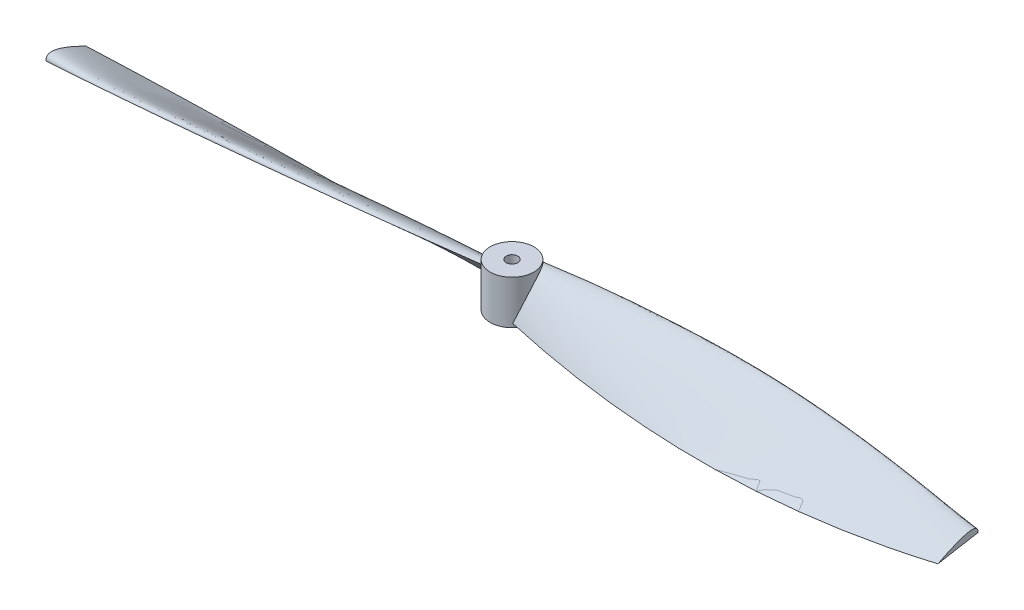
ISO-10303-21;
HEADER;
FILE_DESCRIPTION(('STEP AP214'),'2;1');
FILE_NAME('part.step','',(''),(''),'','','');
FILE_SCHEMA(('AUTOMOTIVE_DESIGN { 1 0 10303 214 1 1 1 1 }'));
ENDSEC;
DATA;
#1=APPLICATION_CONTEXT('core data for automotive mechanical design processes');
#2=APPLICATION_PROTOCOL_DEFINITION('international standard','automotive_design',2000,#1);
#3=PRODUCT_CONTEXT('',#1,'mechanical');
#4=PRODUCT('Part','Part','',(#3));
#5=PRODUCT_RELATED_PRODUCT_CATEGORY('part','',(#4));
#6=PRODUCT_DEFINITION_FORMATION('','',#4);
#7=PRODUCT_DEFINITION_CONTEXT('part definition',#1,'design');
#8=PRODUCT_DEFINITION('design','',#6,#7);
#9=PRODUCT_DEFINITION_SHAPE('','',#8);
#10=(LENGTH_UNIT() NAMED_UNIT(*) SI_UNIT(.MILLI.,.METRE.));
#11=(NAMED_UNIT(*) PLANE_ANGLE_UNIT() SI_UNIT($,.RADIAN.));
#12=(NAMED_UNIT(*) SI_UNIT($,.STERADIAN.) SOLID_ANGLE_UNIT());
#13=UNCERTAINTY_MEASURE_WITH_UNIT(LENGTH_MEASURE(1.E-05),#10,'distance_accuracy_value','');
#14=(GEOMETRIC_REPRESENTATION_CONTEXT(3) GLOBAL_UNCERTAINTY_ASSIGNED_CONTEXT((#13)) GLOBAL_UNIT_ASSIGNED_CONTEXT((#10,
#11,#12)) REPRESENTATION_CONTEXT('',''));
#15=CARTESIAN_POINT('',(0.,0.,0.));
#16=DIRECTION('',(0.,0.,1.));
#17=DIRECTION('',(1.,0.,0.));
#18=AXIS2_PLACEMENT_3D('',#15,#16,#17);
#19=CARTESIAN_POINT('',(0.,15.,0.));
#20=DIRECTION('',(0.,-1.,0.));
#21=DIRECTION('',(0.,0.,-1.));
#22=AXIS2_PLACEMENT_3D('',#19,#20,#21);
#23=CYLINDRICAL_SURFACE('',#22,6.);
#24=CARTESIAN_POINT('',(0.,15.,0.));
#25=DIRECTION('',(0.,1.,0.));
#26=DIRECTION('',(0.,0.,1.));
#27=AXIS2_PLACEMENT_3D('',#24,#25,#26);
#28=CIRCLE('',#27,6.);
#29=CARTESIAN_POINT('',(0.,15.,6.));
#30=VERTEX_POINT('',#29);
#31=EDGE_CURVE('E229',#30,#30,#28,.T.);
#32=ORIENTED_EDGE('',*,*,#31,.F.);
#33=EDGE_LOOP('',(#32));
#34=FACE_BOUND('',#33,.T.);
#35=CARTESIAN_POINT('',(3.95496399735066,14.1319443424082,-4.51201283017459));
#36=CARTESIAN_POINT('',(4.00119866207085,14.1418761661484,-4.47148350148986));
#37=CARTESIAN_POINT('',(4.04676949293845,14.1521523074791,-4.43028466918364));
#38=CARTESIAN_POINT('',(4.13661155901059,14.1727714372621,-4.34651853911986));
#39=CARTESIAN_POINT('',(4.18088292137542,14.1831144190519,-4.30395137612096));
#40=CARTESIAN_POINT('',(4.26860420712328,14.2033493668861,-4.2169739020823));
#41=CARTESIAN_POINT('',(4.31204130790099,14.2132357187568,-4.17254931182353));
#42=CARTESIAN_POINT('',(4.39763247550506,14.2319387936106,-4.08224218085359));
#43=CARTESIAN_POINT('',(4.4397862119144,14.2407552428506,-4.03635927079315));
#44=CARTESIAN_POINT('',(4.55560015297822,14.2632268135488,-3.9062759979549));
#45=CARTESIAN_POINT('',(4.62781459404936,14.275194959149,-3.82046737537932));
#46=CARTESIAN_POINT('',(4.76764641519559,14.2920571136843,-3.64447150067945));
#47=CARTESIAN_POINT('',(4.83526364729404,14.2969508950097,-3.55428410776972));
#48=CARTESIAN_POINT('',(4.96497447416731,14.2980190313878,-3.37069482613974));
#49=CARTESIAN_POINT('',(5.02709720890441,14.2942426587109,-3.27731405836729));
#50=CARTESIAN_POINT('',(5.14564130596027,14.2770098538055,-3.08785609725892));
#51=CARTESIAN_POINT('',(5.2020635542291,14.2635549284321,-2.99177932590147));
#52=CARTESIAN_POINT('',(5.30445865853128,14.2280256137596,-2.80589847440146));
#53=CARTESIAN_POINT('',(5.35090628198875,14.2067262765733,-2.71620694978279));
#54=CARTESIAN_POINT('',(5.43836092026612,14.1557083341582,-2.53657452656943));
#55=CARTESIAN_POINT('',(5.4793680503625,14.1259899073601,-2.44663363329976));
#56=CARTESIAN_POINT('',(5.55604445243874,14.0585084183418,-2.26714097011901));
#57=CARTESIAN_POINT('',(5.59169658182939,14.0207204207173,-2.17759130498496));
#58=CARTESIAN_POINT('',(5.6576784178956,13.9378735253437,-1.99991538168775));
#59=CARTESIAN_POINT('',(5.68800731050094,13.8928135175219,-1.91178934310424));
#60=CARTESIAN_POINT('',(5.75004997618697,13.7851159174677,-1.7174378661822));
#61=CARTESIAN_POINT('',(5.78047301680915,13.720820378209,-1.61172011025793));
#62=CARTESIAN_POINT('',(5.83443943174986,13.5839701398727,-1.40387416542246));
#63=CARTESIAN_POINT('',(5.85797720082957,13.511408778056,-1.3017489603418));
#64=CARTESIAN_POINT('',(5.89892795100441,13.3594296656734,-1.10141171965112));
#65=CARTESIAN_POINT('',(5.91633809830622,13.2800087639187,-1.00320151314785));
#66=CARTESIAN_POINT('',(5.94575519380071,13.1155595795372,-0.810838930639299));
#67=CARTESIAN_POINT('',(5.95776379699141,13.0305330236137,-0.716685319725059));
#68=CARTESIAN_POINT('',(5.97874259666434,12.8405842957939,-0.516229135785683));
#69=CARTESIAN_POINT('',(5.9868172364012,12.7347789993457,-0.410672681334593));
#70=CARTESIAN_POINT('',(5.99739566852743,12.5179543435598,-0.204665478838717));
#71=CARTESIAN_POINT('',(5.99989577625281,12.4069315850406,-0.104218150663553));
#72=CARTESIAN_POINT('',(6.00009786317036,12.1806777826948,0.091862839330213));
#73=CARTESIAN_POINT('',(5.99779849228568,12.0654455637199,0.1874951389482));
#74=CARTESIAN_POINT('',(5.98901074604875,11.8306365522089,0.375003581181962));
#75=CARTESIAN_POINT('',(5.98248929297612,11.7110325514432,0.466843919187223));
#76=CARTESIAN_POINT('',(5.9657736296792,11.469011736749,0.646265748632677));
#77=CARTESIAN_POINT('',(5.95558095748211,11.3465961208008,0.733849006128762));
#78=CARTESIAN_POINT('',(5.93196894501283,11.0994081860308,0.905101059696859));
#79=CARTESIAN_POINT('',(5.91855019734181,10.9746363039084,0.988770571320956));
#80=CARTESIAN_POINT('',(5.87784826378373,10.6298255472942,1.2132331983065));
#81=CARTESIAN_POINT('',(5.84766254920247,10.4077489447029,1.35037981597137));
#82=CARTESIAN_POINT('',(5.78011913115594,9.95895856317901,1.61520497883173));
#83=CARTESIAN_POINT('',(5.74275698831872,9.7322419919087,1.74287759523708));
#84=CARTESIAN_POINT('',(5.66188080256109,9.2750289323539,1.98998148085972));
#85=CARTESIAN_POINT('',(5.61835801850042,9.04452749187421,2.1094006749335));
#86=CARTESIAN_POINT('',(5.52591312283548,8.58052948491552,2.34090501628557));
#87=CARTESIAN_POINT('',(5.47698332656377,8.34702908347388,2.4529793550768));
#88=CARTESIAN_POINT('',(5.37428337141775,7.87774272146882,2.67049710701097));
#89=CARTESIAN_POINT('',(5.3205086468732,7.64195479590365,2.77593410306971));
#90=CARTESIAN_POINT('',(5.21147228839771,7.18116172874861,2.97536273217888));
#91=CARTESIAN_POINT('',(5.1564352967502,6.95623718118787,3.06966454440444));
#92=CARTESIAN_POINT('',(5.04266161293469,6.50548753510666,3.25318467365871));
#93=CARTESIAN_POINT('',(4.98392804636962,6.27966334468936,3.3424071670317));
#94=CARTESIAN_POINT('',(4.86297497713012,5.82769927044378,3.51605482653032));
#95=CARTESIAN_POINT('',(4.80076321762416,5.6015611012892,3.6004898672123));
#96=CARTESIAN_POINT('',(4.67301842303342,5.14954876154523,3.76479773551994));
#97=CARTESIAN_POINT('',(4.60749806024655,4.92367653865321,3.84468579774269));
#98=CARTESIAN_POINT('',(4.4732353970314,4.47277052232558,4.00007555395276));
#99=CARTESIAN_POINT('',(4.404511224597,4.24773832479611,4.07559753311766));
#100=CARTESIAN_POINT('',(4.33400281681537,4.0226630110739,4.14926735506842));
#101=B_SPLINE_CURVE_WITH_KNOTS('',3,(#35,#36,#37,#38,#39,#40,#41,#42,#43,#44,#45,#46,#47,#48,
#49,#50,#51,#52,#53,#54,#55,#56,#57,#58,#59,#60,#61,#62,#63,#64,#65,#66,#67,#68,#69,#70,#71,#72,
#73,#74,#75,#76,#77,#78,#79,#80,#81,#82,#83,#84,#85,#86,#87,#88,#89,#90,#91,#92,#93,#94,#95,#96,
#97,#98,#99,#100),.UNSPECIFIED.,.F.,.F.,(4,2,2,2,2,2,2,2,2,2,2,2,2,2,2,2,2,2,2,2,2,2,2,2,2,2,2,
2,2,2,2,2,4),(0.,0.186832386850806,0.373646429738278,0.562348377681432,0.751098505178312,
1.08911020703464,1.42713278378886,1.76323914500326,2.09929318910327,2.40848214428971,
2.71766454714664,3.02781653395617,3.33801591033931,3.71968091464173,4.10165576981661,
4.48380704251724,4.86584114666002,5.31452380874846,5.76350295408722,6.21260841273852,
6.66527565736122,7.11775348090461,7.57014825174456,8.35799570943213,9.14633211204672,
9.93579848636275,10.7264016749857,11.5177578493112,12.267749751776,13.0171158106024,
13.7648753611704,14.5099609501117,15.2512481487481),.UNSPECIFIED.);
#102=CARTESIAN_POINT('',(3.95496399735066,14.1319443424082,-4.51201283017459));
#103=VERTEX_POINT('',#102);
#104=CARTESIAN_POINT('',(4.33400281681538,4.02266301107394,4.14926735506841));
#105=VERTEX_POINT('',#104);
#106=EDGE_CURVE('E87',#103,#105,#101,.T.);
#107=ORIENTED_EDGE('',*,*,#106,.F.);
#108=CARTESIAN_POINT('',(4.33400281681538,4.02266301107394,4.14926735506841));
#109=CARTESIAN_POINT('',(4.46618815203607,4.19002698614196,4.01114825737754));
#110=CARTESIAN_POINT('',(4.58992268478001,4.36036705230832,3.8687428713589));
#111=CARTESIAN_POINT('',(4.8208662031274,4.70583878910611,3.57686337538926));
#112=CARTESIAN_POINT('',(4.92808861104108,4.88096643020026,3.42739513721856));
#113=CARTESIAN_POINT('',(5.12622300254722,5.23445980047151,3.12323984429937));
#114=CARTESIAN_POINT('',(5.21719514678378,5.41281077582022,2.96857466842872));
#115=CARTESIAN_POINT('',(5.38373201485981,5.77264291612813,2.65462222658457));
#116=CARTESIAN_POINT('',(5.45929204204786,5.95412501704007,2.49533356850415));
#117=CARTESIAN_POINT('',(5.69228807666882,6.57994067997149,1.94362942629013));
#118=CARTESIAN_POINT('',(5.81307014022031,7.0305191253567,1.54228694537885));
#119=CARTESIAN_POINT('',(5.96977051002967,7.93994168750207,0.730303620174496));
#120=CARTESIAN_POINT('',(6.00543754535854,8.39880625842876,0.319638848780571));
#121=CARTESIAN_POINT('',(5.99569014627772,9.13227165536893,-0.333591584484566));
#122=CARTESIAN_POINT('',(5.97716736483079,9.40657699006194,-0.577179160471801));
#123=CARTESIAN_POINT('',(5.91046712990247,9.95458499931698,-1.0611572273053));
#124=CARTESIAN_POINT('',(5.86228394943976,10.2282875472448,-1.30154709156122));
#125=CARTESIAN_POINT('',(5.73633638917936,10.7730893233621,-1.77611541607573));
#126=CARTESIAN_POINT('',(5.65864202210914,11.0441931680119,-2.01030718491523));
#127=CARTESIAN_POINT('',(5.47337671734091,11.5830370624301,-2.47055866829869));
#128=CARTESIAN_POINT('',(5.36581466201944,11.8507780875653,-2.69662077798773));
#129=CARTESIAN_POINT('',(5.16259271429027,12.2898720080848,-3.06186803979435));
#130=CARTESIAN_POINT('',(5.07558278494719,12.462676605676,-3.20417005687663));
#131=CARTESIAN_POINT('',(4.8883149647486,12.8055081289077,-3.48318679339398));
#132=CARTESIAN_POINT('',(4.78806198124846,12.9755360573754,-3.61990355805283));
#133=CARTESIAN_POINT('',(4.57385762426114,13.3124812731428,-3.88705730959354));
#134=CARTESIAN_POINT('',(4.45988318649478,13.4793927625343,-4.01748319203434));
#135=CARTESIAN_POINT('',(4.21796805153895,13.8090515115888,-4.27075532933734));
#136=CARTESIAN_POINT('',(4.09001633973535,13.9717953605076,-4.39359548529906));
#137=CARTESIAN_POINT('',(3.95496399735066,14.1319443424082,-4.51201283017459));
#138=B_SPLINE_CURVE_WITH_KNOTS('',3,(#108,#109,#110,#111,#112,#113,#114,#115,#116,#117,#118,
#119,#120,#121,#122,#123,#124,#125,#126,#127,#128,#129,#130,#131,#132,#133,#134,#135,#136,#137),
.UNSPECIFIED.,.F.,.F.,(4,2,2,2,2,2,2,2,2,2,2,2,2,2,4),(0.,0.761912345224491,1.52320204331146,
2.28161213718473,3.04025300296389,4.87934941174568,6.72386839850998,7.82474773694386,
8.92583970548571,10.0243355816356,11.1225051244168,11.8426242918347,12.5624773560645,
13.2835577677298,14.0052105737999),.UNSPECIFIED.);
#139=EDGE_CURVE('E217',#105,#103,#138,.T.);
#140=ORIENTED_EDGE('',*,*,#139,.F.);
#141=EDGE_LOOP('',(#107,#140));
#142=FACE_BOUND('',#141,.T.);
#143=CARTESIAN_POINT('',(-3.95496399735066,14.1319443424082,4.51201283017459));
#144=CARTESIAN_POINT('',(-4.07301258590449,13.9919720922848,4.40851566135976));
#145=CARTESIAN_POINT('',(-4.18563428903774,13.8500035140051,4.3016278281284));
#146=CARTESIAN_POINT('',(-4.40009913790186,13.5628696315802,4.08199796443968));
#147=CARTESIAN_POINT('',(-4.50195563609008,13.417708563861,3.96926345095488));
#148=CARTESIAN_POINT('',(-4.69523078552242,13.124676312486,3.73863911310308));
#149=CARTESIAN_POINT('',(-4.78665264497937,12.9768059781311,3.62075088878637));
#150=CARTESIAN_POINT('',(-4.95881266970242,12.6795854354442,3.38109932242871));
#151=CARTESIAN_POINT('',(-5.03960495200348,12.5302472434192,3.25935986243932));
#152=CARTESIAN_POINT('',(-5.19124775832872,12.2296795403326,3.01197594581293));
#153=CARTESIAN_POINT('',(-5.26209527722762,12.0784494725521,2.88633032275507));
#154=CARTESIAN_POINT('',(-5.39393602853731,11.7745051656814,2.63173064198554));
#155=CARTESIAN_POINT('',(-5.45492816218919,11.6217907631148,2.50277621723621));
#156=CARTESIAN_POINT('',(-5.6823064639648,11.0006231380654,1.97459479571869));
#157=CARTESIAN_POINT('',(-5.80832968687274,10.5269049010096,1.56342091917948));
#158=CARTESIAN_POINT('',(-5.97108525735197,9.57442063696116,0.726859754562274));
#159=CARTESIAN_POINT('',(-6.00753848388859,9.09564348835387,0.301432212840051));
#160=CARTESIAN_POINT('',(-5.99351259472467,8.3371211120348,-0.37511009284523));
#161=CARTESIAN_POINT('',(-5.9725920477003,8.05640523298941,-0.626043476940594));
#162=CARTESIAN_POINT('',(-5.89884471414157,7.49704958452404,-1.12580960279973));
#163=CARTESIAN_POINT('',(-5.84600900913781,7.21841041746801,-1.37464173766871));
#164=CARTESIAN_POINT('',(-5.70797979713915,6.66573609371351,-1.86655299579988));
#165=CARTESIAN_POINT('',(-5.62289222708136,6.39168889867209,-2.10964821536638));
#166=CARTESIAN_POINT('',(-5.4194903260282,5.84919257114887,-2.58777528815577));
#167=CARTESIAN_POINT('',(-5.30119858375689,5.58073976572822,-2.82281250166595));
#168=CARTESIAN_POINT('',(-5.05194321798434,5.09399236770938,-3.2446655765344));
#169=CARTESIAN_POINT('',(-4.92606393610409,4.87456512655725,-3.43316458360225));
#170=CARTESIAN_POINT('',(-4.71842967964133,4.5507839047498,-3.70804752102877));
#171=CARTESIAN_POINT('',(-4.64605764554573,4.44371854823619,-3.79839035923032));
#172=CARTESIAN_POINT('',(-4.49488236250091,4.2316028575674,-3.97613314758453));
#173=CARTESIAN_POINT('',(-4.41607621271332,4.12655345896766,-4.06353174495334));
#174=CARTESIAN_POINT('',(-4.33400281681538,4.02266301107394,-4.14926735506841));
#175=B_SPLINE_CURVE_WITH_KNOTS('',3,(#143,#144,#145,#146,#147,#148,#149,#150,#151,#152,#153,
#154,#155,#156,#157,#158,#159,#160,#161,#162,#163,#164,#165,#166,#167,#168,#169,#170,#171,#172,
#173,#174),.UNSPECIFIED.,.F.,.F.,(4,2,2,2,2,2,2,2,2,2,2,2,2,2,2,4),(0.,0.630816559205775,
1.26084127836206,1.89067176660723,2.5171601660567,3.14383747314004,3.770584599198,
5.68260193857561,7.60057005653625,8.73068781320409,9.86112151962698,10.9878738496593,
12.1138615026561,13.0590552259744,13.5319380894295,14.0050353433539),.UNSPECIFIED.);
#176=CARTESIAN_POINT('',(-3.95496399735066,14.1319443424082,4.51201283017459));
#177=VERTEX_POINT('',#176);
#178=CARTESIAN_POINT('',(-4.33400281681538,4.02266301107394,-4.14926735506841));
#179=VERTEX_POINT('',#178);
#180=EDGE_CURVE('E73',#177,#179,#175,.T.);
#181=ORIENTED_EDGE('',*,*,#180,.T.);
#182=CARTESIAN_POINT('',(-4.33400281681537,4.0226630110739,-4.14926735506842));
#183=CARTESIAN_POINT('',(-4.41108668865342,4.26874073267822,-4.06871979126731));
#184=CARTESIAN_POINT('',(-4.48604335446543,4.51476782030348,-3.9859626385582));
#185=CARTESIAN_POINT('',(-4.6319452731176,5.00710640198958,-3.81546568438151));
#186=CARTESIAN_POINT('',(-4.70287884359336,5.25341679718309,-3.72771272044549));
#187=CARTESIAN_POINT('',(-4.84066459008062,5.74574710957774,-3.54695419321539));
#188=CARTESIAN_POINT('',(-4.90750984457173,5.99176587841737,-3.45394020882212));
#189=CARTESIAN_POINT('',(-5.03694526455831,6.48292857639192,-3.26229479269454));
#190=CARTESIAN_POINT('',(-5.09953268926733,6.72807184755887,-3.16365981637098));
#191=CARTESIAN_POINT('',(-5.22246670363477,7.22607886270326,-2.95649935282011));
#192=CARTESIAN_POINT('',(-5.28264212260617,7.47888873374958,-2.84774199304517));
#193=CARTESIAN_POINT('',(-5.39774534695752,7.98230680401593,-2.62302792544999));
#194=CARTESIAN_POINT('',(-5.45267647326811,8.2329163040701,-2.50707585146011));
#195=CARTESIAN_POINT('',(-5.55672309448359,8.73123159179376,-2.26713834191786));
#196=CARTESIAN_POINT('',(-5.60584338975269,8.97893962178,-2.14315967007601));
#197=CARTESIAN_POINT('',(-5.69748484997761,9.47070022240386,-1.88607979810628));
#198=CARTESIAN_POINT('',(-5.74000925224542,9.71475453283189,-1.75298311970252));
#199=CARTESIAN_POINT('',(-5.80327945540175,10.1104028425424,-1.52653258394716));
#200=CARTESIAN_POINT('',(-5.82632834723899,10.2634091240948,-1.43628473933333));
#201=CARTESIAN_POINT('',(-5.86887649932391,10.5671156133497,-1.2511273240876));
#202=CARTESIAN_POINT('',(-5.88837533088339,10.7178155405382,-1.15621719221515));
#203=CARTESIAN_POINT('',(-5.92332650115371,11.0164440326146,-0.961257679888069));
#204=CARTESIAN_POINT('',(-5.93877700866743,11.1643713153468,-0.861205998123435));
#205=CARTESIAN_POINT('',(-5.964875173711,11.4554723817944,-0.656379408553755));
#206=CARTESIAN_POINT('',(-5.97556283118164,11.598676025915,-0.551652290592832));
#207=CARTESIAN_POINT('',(-5.99154803090523,11.8807466788163,-0.336186441382137));
#208=CARTESIAN_POINT('',(-5.99684735588509,12.0196151071523,-0.225449711190232));
#209=CARTESIAN_POINT('',(-6.00108258088698,12.2918502788268,0.00256581819714362));
#210=CARTESIAN_POINT('',(-6.00002350858163,12.4252212850489,0.119839375952374));
#211=CARTESIAN_POINT('',(-5.99184928443638,12.6440156510454,0.323392098486134));
#212=CARTESIAN_POINT('',(-5.98675134514429,12.7312847879262,0.407769522599553));
#213=CARTESIAN_POINT('',(-5.9725225072129,12.9019510093369,0.580040643367135));
#214=CARTESIAN_POINT('',(-5.96339187659988,12.9853483507924,0.667934105980487));
#215=CARTESIAN_POINT('',(-5.94052560537882,13.1477068287313,0.847568657884288));
#216=CARTESIAN_POINT('',(-5.92677882809848,13.2266566923447,0.939318578215554));
#217=CARTESIAN_POINT('',(-5.89406794972715,13.3789664514997,1.12649396291793));
#218=CARTESIAN_POINT('',(-5.87510361169037,13.4523260929786,1.22191959404531));
#219=CARTESIAN_POINT('',(-5.83092289173632,13.5935140043611,1.4179565851827));
#220=CARTESIAN_POINT('',(-5.80560657998818,13.6612282888337,1.51862821975923));
#221=CARTESIAN_POINT('',(-5.74819761162671,13.7883428926302,1.72322444655154));
#222=CARTESIAN_POINT('',(-5.71610763568723,13.8477464854873,1.82714773810859));
#223=CARTESIAN_POINT('',(-5.64472240114243,13.9565313129221,2.03698752178088));
#224=CARTESIAN_POINT('',(-5.60546751730789,14.0059655945161,2.1428900009008));
#225=CARTESIAN_POINT('',(-5.51923979128609,14.0938677427188,2.35609736414504));
#226=CARTESIAN_POINT('',(-5.47226965545199,14.1323394418828,2.46340174440518));
#227=CARTESIAN_POINT('',(-5.37793384049103,14.1926537882022,2.66235464891089));
#228=CARTESIAN_POINT('',(-5.33161431512735,14.2160992691008,2.75401581515384));
#229=CARTESIAN_POINT('',(-5.23347444740558,14.2540822443566,2.93623017605696));
#230=CARTESIAN_POINT('',(-5.18165444368938,14.2686202867354,3.02678343854384));
#231=CARTESIAN_POINT('',(-5.0725206827319,14.2891039430543,3.2063452317342));
#232=CARTESIAN_POINT('',(-5.01517224389292,14.2949909693808,3.29533923285413));
#233=CARTESIAN_POINT('',(-4.8957678407628,14.2987433865475,3.4702550971592));
#234=CARTESIAN_POINT('',(-4.83371223255996,14.2966093835713,3.55617719200609));
#235=CARTESIAN_POINT('',(-4.72869322051909,14.2875642568122,3.69377916775132));
#236=CARTESIAN_POINT('',(-4.68697695956231,14.2826685713902,3.74656644520182));
#237=CARTESIAN_POINT('',(-4.60192932436234,14.2705332147019,3.85055274882306));
#238=CARTESIAN_POINT('',(-4.55859783723082,14.2632933793299,3.90175166352303));
#239=CARTESIAN_POINT('',(-4.47038247582018,14.2469299598115,4.0025202516602));
#240=CARTESIAN_POINT('',(-4.42549785621833,14.2378054605097,4.05208911997322));
#241=CARTESIAN_POINT('',(-4.33480178764063,14.2183354590592,4.14895659619051));
#242=CARTESIAN_POINT('',(-4.28900858737152,14.2080063970305,4.19627565903189));
#243=CARTESIAN_POINT('',(-4.19600122676346,14.1866346085878,4.28927726650552));
#244=CARTESIAN_POINT('',(-4.14878779011599,14.1755922424585,4.33496061947729));
#245=CARTESIAN_POINT('',(-4.05295447384784,14.1535527352288,4.42468685464986));
#246=CARTESIAN_POINT('',(-4.00433682755219,14.1425555510013,4.46873211168516));
#247=CARTESIAN_POINT('',(-3.95496399735066,14.1319443424082,4.51201283017459));
#248=B_SPLINE_CURVE_WITH_KNOTS('',3,(#182,#183,#184,#185,#186,#187,#188,#189,#190,#191,#192,
#193,#194,#195,#196,#197,#198,#199,#200,#201,#202,#203,#204,#205,#206,#207,#208,#209,#210,#211,
#212,#213,#214,#215,#216,#217,#218,#219,#220,#221,#222,#223,#224,#225,#226,#227,#228,#229,#230,
#231,#232,#233,#234,#235,#236,#237,#238,#239,#240,#241,#242,#243,#244,#245,#246,#247),
.UNSPECIFIED.,.F.,.F.,(4,2,2,2,2,2,2,2,2,2,2,2,2,2,2,2,2,2,2,2,2,2,2,2,2,2,2,2,2,2,2,2,4),(0.,
0.810457974641976,1.62316011511679,2.43720210353802,3.25176323144542,4.09676760323373,
4.94123327940382,5.78499639206722,6.62834406027042,7.16563599817206,7.70299277389417,
8.24059219670847,8.77358743964957,9.30640628396648,9.83880387657494,10.2031430076447,
10.5674579271479,10.9326581649343,11.2978749903477,11.6692435912183,12.0404654977953,
12.4096567363571,12.7787187456391,13.0942337853487,13.4097294113463,13.727351988257,
14.0449505615467,14.2472534193782,14.4495704427854,14.6519859392632,14.8519059372189,
15.0517257348667,15.2512435537562),.UNSPECIFIED.);
#249=EDGE_CURVE('E12',#179,#177,#248,.T.);
#250=ORIENTED_EDGE('',*,*,#249,.T.);
#251=EDGE_LOOP('',(#181,#250));
#252=FACE_BOUND('',#251,.T.);
#253=CARTESIAN_POINT('',(0.,3.,0.));
#254=DIRECTION('',(0.,-1.,0.));
#255=DIRECTION('',(0.,0.,-1.));
#256=AXIS2_PLACEMENT_3D('',#253,#254,#255);
#257=CIRCLE('',#256,6.);
#258=CARTESIAN_POINT('',(0.,3.,-6.));
#259=VERTEX_POINT('',#258);
#260=EDGE_CURVE('E327',#259,#259,#257,.T.);
#261=ORIENTED_EDGE('',*,*,#260,.F.);
#262=EDGE_LOOP('',(#261));
#263=FACE_BOUND('',#262,.T.);
#264=ADVANCED_FACE('F63',(#34,#142,#252,#263),#23,.T.);
#265=CARTESIAN_POINT('',(0.,-5.,0.));
#266=DIRECTION('',(0.,1.,0.));
#267=DIRECTION('',(0.,0.,1.));
#268=AXIS2_PLACEMENT_3D('',#265,#266,#267);
#269=CYLINDRICAL_SURFACE('',#268,1.5875);
#270=CARTESIAN_POINT('',(0.,15.,0.));
#271=DIRECTION('',(0.,1.,0.));
#272=DIRECTION('',(0.,0.,1.));
#273=AXIS2_PLACEMENT_3D('',#270,#271,#272);
#274=CIRCLE('',#273,1.5875);
#275=CARTESIAN_POINT('',(0.,15.,1.5875));
#276=VERTEX_POINT('',#275);
#277=EDGE_CURVE('E124',#276,#276,#274,.T.);
#278=ORIENTED_EDGE('',*,*,#277,.T.);
#279=EDGE_LOOP('',(#278));
#280=FACE_BOUND('',#279,.T.);
#281=CARTESIAN_POINT('',(0.,3.,0.));
#282=DIRECTION('',(0.,-1.,0.));
#283=DIRECTION('',(0.,0.,-1.));
#284=AXIS2_PLACEMENT_3D('',#281,#282,#283);
#285=CIRCLE('',#284,1.5875);
#286=CARTESIAN_POINT('',(0.,3.,-1.5875));
#287=VERTEX_POINT('',#286);
#288=EDGE_CURVE('E68',#287,#287,#285,.F.);
#289=ORIENTED_EDGE('',*,*,#288,.F.);
#290=EDGE_LOOP('',(#289));
#291=FACE_BOUND('',#290,.T.);
#292=ADVANCED_FACE('F191',(#280,#291),#269,.F.);
#293=CARTESIAN_POINT('',(0.,15.,0.));
#294=DIRECTION('',(0.,1.,0.));
#295=DIRECTION('',(0.,0.,1.));
#296=AXIS2_PLACEMENT_3D('',#293,#294,#295);
#297=PLANE('',#296);
#298=ORIENTED_EDGE('',*,*,#277,.F.);
#299=EDGE_LOOP('',(#298));
#300=FACE_BOUND('',#299,.T.);
#301=ORIENTED_EDGE('',*,*,#31,.T.);
#302=EDGE_LOOP('',(#301));
#303=FACE_BOUND('',#302,.T.);
#304=ADVANCED_FACE('F148',(#300,#303),#297,.T.);
#305=CARTESIAN_POINT('',(0.,14.0584355167066,-3.90091693224477));
#306=CARTESIAN_POINT('',(20.0163613845974,14.488211674464,-7.07602997354054));
#307=CARTESIAN_POINT('',(59.9933725801323,13.5934025627138,-10.9182818600998));
#308=CARTESIAN_POINT('',(100.016361384597,9.17942540515399,-9.74984596442364));
#309=CARTESIAN_POINT('',(120.,6.0952561127416,-7.91164091856942));
#310=CARTESIAN_POINT('',(0.,14.4872984936383,-2.64812471884785));
#311=CARTESIAN_POINT('',(20.011637464951,13.9857753783964,-3.7486819429666));
#312=CARTESIAN_POINT('',(59.9980964999185,21.7663283521157,-12.2435260702604));
#313=CARTESIAN_POINT('',(100.011637464951,9.94020444360194,-8.30165373242463));
#314=CARTESIAN_POINT('',(120.,8.63272193477932,-8.1401945865525));
#315=CARTESIAN_POINT('',(0.,15.8722613637868,-0.227005169572741));
#316=CARTESIAN_POINT('',(20.0069135453046,14.4394389755456,0.746993423485537));
#317=CARTESIAN_POINT('',(60.0028204197048,-4.98079442512257,11.5994111827611));
#318=CARTESIAN_POINT('',(100.006913545305,7.51916087378821,-2.96012861079376));
#319=CARTESIAN_POINT('',(120.,7.98836514855535,-4.47541536490372));
#320=CARTESIAN_POINT('',(0.,4.5168775627204,3.5131314779472));
#321=CARTESIAN_POINT('',(20.0021896256583,2.15275590147992,6.5616858881825));
#322=CARTESIAN_POINT('',(60.007544339491,-0.270490450584237,9.53848986965222));
#323=CARTESIAN_POINT('',(100.002189625658,1.9162946957128,6.27472940046898));
#324=CARTESIAN_POINT('',(120.,4.16218575406971,3.08269674637692));
#325=B_SPLINE_SURFACE_WITH_KNOTS('',3,3,((#305,#306,#307,#308,#309),(#310,#311,#312,#313,#314),
(#315,#316,#317,#318,#319),(#320,#321,#322,#323,#324)),.UNSPECIFIED.,.F.,.F.,.F.,(4,4),(4,1,4),
(0.,1.),(0.,0.499939162718313,1.),.UNSPECIFIED.);
#326=CARTESIAN_POINT('',(0.,14.0584355167066,-3.90091693224477));
#327=CARTESIAN_POINT('',(20.0163613845974,14.488211674464,-7.07602997354054));
#328=CARTESIAN_POINT('',(59.9933725801323,13.5934025627138,-10.9182818600998));
#329=CARTESIAN_POINT('',(100.016361384597,9.17942540515399,-9.74984596442364));
#330=CARTESIAN_POINT('',(120.,6.0952561127416,-7.91164091856942));
#331=B_SPLINE_CURVE_WITH_KNOTS('',3,(#326,#327,#328,#329,#330),.UNSPECIFIED.,.F.,.F.,(4,1,4),
(0.,0.499939162718313,1.),.UNSPECIFIED.);
#332=CARTESIAN_POINT('',(120.,6.0952561127416,-7.91164091856942));
#333=VERTEX_POINT('',#332);
#334=EDGE_CURVE('E230',#333,#103,#331,.F.);
#335=CARTESIAN_POINT('',(0.,4.5168775627204,3.5131314779472));
#336=CARTESIAN_POINT('',(20.0021896256583,2.15275590147992,6.5616858881825));
#337=CARTESIAN_POINT('',(60.007544339491,-0.270490450584237,9.53848986965222));
#338=CARTESIAN_POINT('',(100.002189625658,1.9162946957128,6.27472940046898));
#339=CARTESIAN_POINT('',(120.,4.16218575406971,3.08269674637692));
#340=B_SPLINE_CURVE_WITH_KNOTS('',3,(#335,#336,#337,#338,#339),.UNSPECIFIED.,.F.,.F.,(4,1,4),
(0.,0.499939162718313,1.),.UNSPECIFIED.);
#341=CARTESIAN_POINT('',(120.,4.16218575406971,3.08269674637692));
#342=VERTEX_POINT('',#341);
#343=EDGE_CURVE('E233',#105,#342,#340,.T.);
#344=CARTESIAN_POINT('',(120.,6.0952561127416,-7.91164091856942));
#345=CARTESIAN_POINT('',(120.,9.90145484579818,-8.25447142054404));
#346=CARTESIAN_POINT('',(120.,4.16218575406971,3.08269674637692));
#347=B_SPLINE_CURVE_WITH_KNOTS('',2,(#344,#345,#346),.UNSPECIFIED.,.F.,.F.,(3,3),(0.,1.),.UNSPECIFIED.);
#348=EDGE_CURVE('E234',#333,#342,#347,.T.);
#349=ORIENTED_EDGE('',*,*,#334,.T.);
#350=ORIENTED_EDGE('',*,*,#106,.T.);
#351=ORIENTED_EDGE('',*,*,#343,.T.);
#352=ORIENTED_EDGE('',*,*,#348,.F.);
#353=EDGE_LOOP('',(#349,#350,#351,#352));
#354=FACE_BOUND('',#353,.T.);
#355=ADVANCED_FACE('F211',(#354),#325,.T.);
#356=CARTESIAN_POINT('',(0.,4.51687756272044,3.51313147794718));
#357=CARTESIAN_POINT('',(20.0021896256583,2.15275590147994,6.56168588818249));
#358=CARTESIAN_POINT('',(60.007544339491,-0.270490450584244,9.53848986965222));
#359=CARTESIAN_POINT('',(100.002189625658,1.9162946957128,6.27472940046897));
#360=CARTESIAN_POINT('',(120.,4.16218575406972,3.08269674637689));
#361=CARTESIAN_POINT('',(0.,7.69739688071583,1.0417820078832));
#362=CARTESIAN_POINT('',(20.0069135453046,6.26457449247463,2.01578060094148));
#363=CARTESIAN_POINT('',(60.0028204197048,4.3508072205151,2.71956595973487));
#364=CARTESIAN_POINT('',(100.006913545305,4.33733826552653,0.933204278838096));
#365=CARTESIAN_POINT('',(120.,4.80654254029368,-0.58208247527188));
#366=CARTESIAN_POINT('',(0.,10.8779161987112,-1.42956746218079));
#367=CARTESIAN_POINT('',(20.011637464951,10.3763930834693,-2.53012468629953));
#368=CARTESIAN_POINT('',(59.9980964999185,8.97210489161444,-4.09935795018248));
#369=CARTESIAN_POINT('',(100.011637464951,6.75838183534026,-4.40832084279277));
#370=CARTESIAN_POINT('',(120.,5.45089932651764,-4.24686169692065));
#371=CARTESIAN_POINT('',(0.,14.0584355167066,-3.90091693224477));
#372=CARTESIAN_POINT('',(20.0163613845974,14.488211674464,-7.07602997354054));
#373=CARTESIAN_POINT('',(59.9933725801323,13.5934025627138,-10.9182818600998));
#374=CARTESIAN_POINT('',(100.016361384597,9.17942540515399,-9.74984596442365));
#375=CARTESIAN_POINT('',(120.,6.0952561127416,-7.91164091856942));
#376=B_SPLINE_SURFACE_WITH_KNOTS('',3,3,((#356,#357,#358,#359,#360),(#361,#362,#363,#364,#365),
(#366,#367,#368,#369,#370),(#371,#372,#373,#374,#375)),.UNSPECIFIED.,.F.,.F.,.F.,(4,4),(4,1,4),
(0.,1.),(0.,0.499939162718313,1.),.UNSPECIFIED.);
#377=CARTESIAN_POINT('',(120.,4.16218575406972,3.08269674637689));
#378=CARTESIAN_POINT('',(120.,6.0952561127416,-7.91164091856942));
#379=B_SPLINE_CURVE_WITH_KNOTS('',1,(#377,#378),.UNSPECIFIED.,.F.,.F.,(2,2),(0.,1.),.UNSPECIFIED.);
#380=EDGE_CURVE('E228',#342,#333,#379,.T.);
#381=ORIENTED_EDGE('',*,*,#343,.F.);
#382=ORIENTED_EDGE('',*,*,#139,.T.);
#383=ORIENTED_EDGE('',*,*,#334,.F.);
#384=ORIENTED_EDGE('',*,*,#380,.F.);
#385=EDGE_LOOP('',(#381,#382,#383,#384));
#386=FACE_BOUND('',#385,.T.);
#387=ADVANCED_FACE('F285',(#386),#376,.T.);
#388=CARTESIAN_POINT('',(120.,7.51508788960191,-5.33447175332015));
#389=DIRECTION('',(-1.,0.,0.));
#390=DIRECTION('',(0.,0.,1.));
#391=AXIS2_PLACEMENT_3D('',#388,#389,#390);
#392=PLANE('',#391);
#393=ORIENTED_EDGE('',*,*,#380,.T.);
#394=ORIENTED_EDGE('',*,*,#348,.T.);
#395=EDGE_LOOP('',(#393,#394));
#396=FACE_BOUND('',#395,.T.);
#397=ADVANCED_FACE('F65',(#396),#392,.F.);
#398=CARTESIAN_POINT('',(0.,14.0584355167066,3.90091693224477));
#399=CARTESIAN_POINT('',(-20.0163613845974,14.488211674464,7.07602997354054));
#400=CARTESIAN_POINT('',(-59.9933725801323,13.5934025627138,10.9182818600998));
#401=CARTESIAN_POINT('',(-100.016361384597,9.17942540515399,9.74984596442364));
#402=CARTESIAN_POINT('',(-120.,6.0952561127416,7.91164091856942));
#403=CARTESIAN_POINT('',(0.,14.4872984936383,2.64812471884785));
#404=CARTESIAN_POINT('',(-20.011637464951,13.9857753783964,3.7486819429666));
#405=CARTESIAN_POINT('',(-59.9980964999185,21.7663283521157,12.2435260702604));
#406=CARTESIAN_POINT('',(-100.011637464951,9.94020444360194,8.30165373242463));
#407=CARTESIAN_POINT('',(-120.,8.63272193477932,8.1401945865525));
#408=CARTESIAN_POINT('',(0.,15.8722613637868,0.227005169572741));
#409=CARTESIAN_POINT('',(-20.0069135453046,14.4394389755456,-0.746993423485537));
#410=CARTESIAN_POINT('',(-60.0028204197048,-4.98079442512257,-11.5994111827611));
#411=CARTESIAN_POINT('',(-100.006913545305,7.51916087378821,2.96012861079376));
#412=CARTESIAN_POINT('',(-120.,7.98836514855535,4.47541536490372));
#413=CARTESIAN_POINT('',(0.,4.5168775627204,-3.5131314779472));
#414=CARTESIAN_POINT('',(-20.0021896256583,2.15275590147992,-6.5616858881825));
#415=CARTESIAN_POINT('',(-60.007544339491,-0.270490450584237,-9.53848986965222));
#416=CARTESIAN_POINT('',(-100.002189625658,1.9162946957128,-6.27472940046898));
#417=CARTESIAN_POINT('',(-120.,4.16218575406971,-3.08269674637692));
#418=B_SPLINE_SURFACE_WITH_KNOTS('',3,3,((#398,#399,#400,#401,#402),(#403,#404,#405,#406,#407),
(#408,#409,#410,#411,#412),(#413,#414,#415,#416,#417)),.UNSPECIFIED.,.F.,.F.,.F.,(4,4),(4,1,4),
(0.,1.),(0.,0.499939162718313,1.),.UNSPECIFIED.);
#419=CARTESIAN_POINT('',(0.,4.5168775627204,-3.5131314779472));
#420=CARTESIAN_POINT('',(-20.0021896256583,2.15275590147992,-6.5616858881825));
#421=CARTESIAN_POINT('',(-60.007544339491,-0.270490450584237,-9.53848986965222));
#422=CARTESIAN_POINT('',(-100.002189625658,1.9162946957128,-6.27472940046898));
#423=CARTESIAN_POINT('',(-120.,4.16218575406971,-3.08269674637692));
#424=B_SPLINE_CURVE_WITH_KNOTS('',3,(#419,#420,#421,#422,#423),.UNSPECIFIED.,.F.,.F.,(4,1,4),
(0.,0.499939162718313,1.),.UNSPECIFIED.);
#425=CARTESIAN_POINT('',(-120.,4.16218575406971,-3.08269674637692));
#426=VERTEX_POINT('',#425);
#427=EDGE_CURVE('E80',#179,#426,#424,.T.);
#428=CARTESIAN_POINT('',(-120.,6.0952561127416,7.91164091856942));
#429=CARTESIAN_POINT('',(-120.,9.90145484579818,8.25447142054404));
#430=CARTESIAN_POINT('',(-120.,4.16218575406971,-3.08269674637692));
#431=B_SPLINE_CURVE_WITH_KNOTS('',2,(#428,#429,#430),.UNSPECIFIED.,.F.,.F.,(3,3),(0.,1.),.UNSPECIFIED.);
#432=CARTESIAN_POINT('',(-120.,6.0952561127416,7.91164091856942));
#433=VERTEX_POINT('',#432);
#434=EDGE_CURVE('E112',#433,#426,#431,.T.);
#435=CARTESIAN_POINT('',(0.,14.0584355167066,3.90091693224477));
#436=CARTESIAN_POINT('',(-20.0163613845974,14.488211674464,7.07602997354054));
#437=CARTESIAN_POINT('',(-59.9933725801323,13.5934025627138,10.9182818600998));
#438=CARTESIAN_POINT('',(-100.016361384597,9.17942540515399,9.74984596442364));
#439=CARTESIAN_POINT('',(-120.,6.0952561127416,7.91164091856942));
#440=B_SPLINE_CURVE_WITH_KNOTS('',3,(#435,#436,#437,#438,#439),.UNSPECIFIED.,.F.,.F.,(4,1,4),
(0.,0.499939162718313,1.),.UNSPECIFIED.);
#441=EDGE_CURVE('E104',#433,#177,#440,.F.);
#442=ORIENTED_EDGE('',*,*,#249,.F.);
#443=ORIENTED_EDGE('',*,*,#427,.T.);
#444=ORIENTED_EDGE('',*,*,#434,.F.);
#445=ORIENTED_EDGE('',*,*,#441,.T.);
#446=EDGE_LOOP('',(#442,#443,#444,#445));
#447=FACE_BOUND('',#446,.T.);
#448=ADVANCED_FACE('F116',(#447),#418,.T.);
#449=CARTESIAN_POINT('',(0.,4.51687756272044,-3.51313147794718));
#450=CARTESIAN_POINT('',(-20.0021896256583,2.15275590147994,-6.56168588818249));
#451=CARTESIAN_POINT('',(-60.007544339491,-0.270490450584244,-9.53848986965222));
#452=CARTESIAN_POINT('',(-100.002189625658,1.9162946957128,-6.27472940046897));
#453=CARTESIAN_POINT('',(-120.,4.16218575406972,-3.08269674637689));
#454=CARTESIAN_POINT('',(0.,7.69739688071583,-1.0417820078832));
#455=CARTESIAN_POINT('',(-20.0069135453046,6.26457449247463,-2.01578060094148));
#456=CARTESIAN_POINT('',(-60.0028204197048,4.3508072205151,-2.71956595973487));
#457=CARTESIAN_POINT('',(-100.006913545305,4.33733826552653,-0.933204278838096));
#458=CARTESIAN_POINT('',(-120.,4.80654254029368,0.58208247527188));
#459=CARTESIAN_POINT('',(0.,10.8779161987112,1.42956746218079));
#460=CARTESIAN_POINT('',(-20.011637464951,10.3763930834693,2.53012468629953));
#461=CARTESIAN_POINT('',(-59.9980964999185,8.97210489161444,4.09935795018248));
#462=CARTESIAN_POINT('',(-100.011637464951,6.75838183534026,4.40832084279277));
#463=CARTESIAN_POINT('',(-120.,5.45089932651764,4.24686169692065));
#464=CARTESIAN_POINT('',(0.,14.0584355167066,3.90091693224477));
#465=CARTESIAN_POINT('',(-20.0163613845974,14.488211674464,7.07602997354054));
#466=CARTESIAN_POINT('',(-59.9933725801323,13.5934025627138,10.9182818600998));
#467=CARTESIAN_POINT('',(-100.016361384597,9.17942540515399,9.74984596442365));
#468=CARTESIAN_POINT('',(-120.,6.0952561127416,7.91164091856942));
#469=B_SPLINE_SURFACE_WITH_KNOTS('',3,3,((#449,#450,#451,#452,#453),(#454,#455,#456,#457,#458),
(#459,#460,#461,#462,#463),(#464,#465,#466,#467,#468)),.UNSPECIFIED.,.F.,.F.,.F.,(4,4),(4,1,4),
(0.,1.),(0.,0.499939162718313,1.),.UNSPECIFIED.);
#470=CARTESIAN_POINT('',(-120.,4.16218575406972,-3.08269674637689));
#471=CARTESIAN_POINT('',(-120.,6.0952561127416,7.91164091856942));
#472=B_SPLINE_CURVE_WITH_KNOTS('',1,(#470,#471),.UNSPECIFIED.,.F.,.F.,(2,2),(0.,1.),.UNSPECIFIED.);
#473=EDGE_CURVE('E108',#426,#433,#472,.T.);
#474=ORIENTED_EDGE('',*,*,#180,.F.);
#475=ORIENTED_EDGE('',*,*,#441,.F.);
#476=ORIENTED_EDGE('',*,*,#473,.F.);
#477=ORIENTED_EDGE('',*,*,#427,.F.);
#478=EDGE_LOOP('',(#474,#475,#476,#477));
#479=FACE_BOUND('',#478,.T.);
#480=ADVANCED_FACE('F106',(#479),#469,.T.);
#481=CARTESIAN_POINT('',(-120.,7.51508788960191,5.33447175332015));
#482=DIRECTION('',(1.,0.,0.));
#483=DIRECTION('',(0.,0.,-1.));
#484=AXIS2_PLACEMENT_3D('',#481,#482,#483);
#485=PLANE('',#484);
#486=ORIENTED_EDGE('',*,*,#473,.T.);
#487=ORIENTED_EDGE('',*,*,#434,.T.);
#488=EDGE_LOOP('',(#486,#487));
#489=FACE_BOUND('',#488,.T.);
#490=ADVANCED_FACE('F123',(#489),#485,.F.);
#491=CARTESIAN_POINT('',(0.,3.,0.));
#492=DIRECTION('',(0.,-1.,0.));
#493=DIRECTION('',(0.,0.,-1.));
#494=AXIS2_PLACEMENT_3D('',#491,#492,#493);
#495=PLANE('',#494);
#496=ORIENTED_EDGE('',*,*,#260,.T.);
#497=EDGE_LOOP('',(#496));
#498=FACE_BOUND('',#497,.T.);
#499=ORIENTED_EDGE('',*,*,#288,.T.);
#500=EDGE_LOOP('',(#499));
#501=FACE_BOUND('',#500,.T.);
#502=ADVANCED_FACE('F143',(#498,#501),#495,.T.);
#503=CLOSED_SHELL('',(#264,#292,#304,#355,#387,#397,#448,#480,#490,#502));
#504=MANIFOLD_SOLID_BREP('B2',#503);
#505=ADVANCED_BREP_SHAPE_REPRESENTATION('',(#18,#504),#14);
#506=SHAPE_DEFINITION_REPRESENTATION(#9,#505);
ENDSEC;
END-ISO-10303-21;
